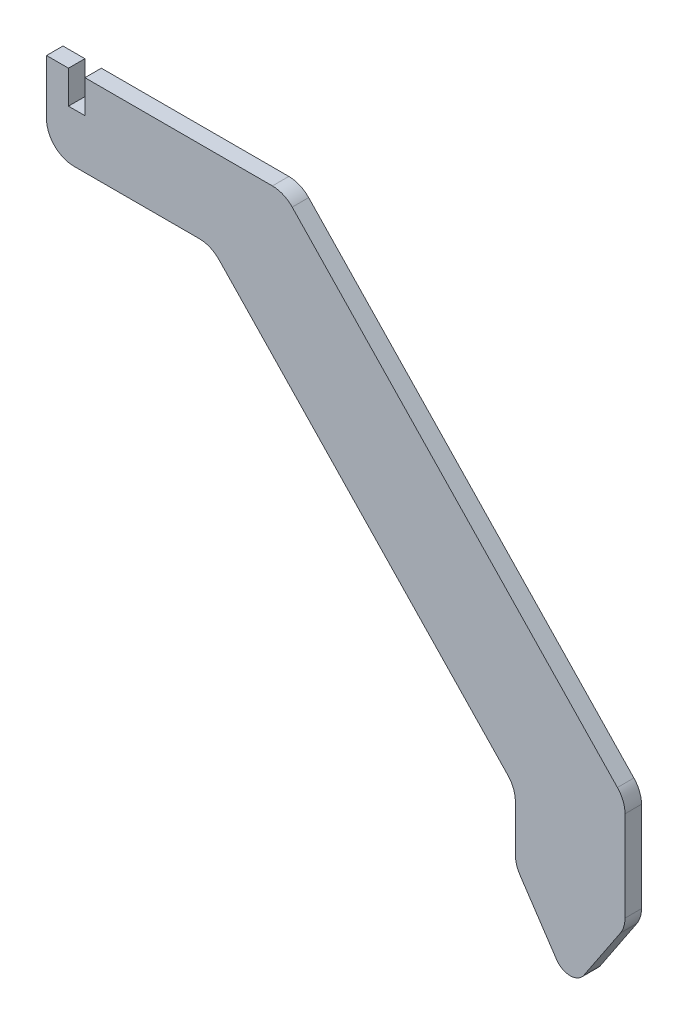
ISO-10303-21;
HEADER;
FILE_DESCRIPTION(('STEP AP214'),'2;1');
FILE_NAME('part.step','',(''),(''),'','','');
FILE_SCHEMA(('AUTOMOTIVE_DESIGN { 1 0 10303 214 1 1 1 1 }'));
ENDSEC;
DATA;
#1=APPLICATION_CONTEXT('core data for automotive mechanical design processes');
#2=APPLICATION_PROTOCOL_DEFINITION('international standard','automotive_design',2000,#1);
#3=PRODUCT_CONTEXT('',#1,'mechanical');
#4=PRODUCT('Part','Part','',(#3));
#5=PRODUCT_RELATED_PRODUCT_CATEGORY('part','',(#4));
#6=PRODUCT_DEFINITION_FORMATION('','',#4);
#7=PRODUCT_DEFINITION_CONTEXT('part definition',#1,'design');
#8=PRODUCT_DEFINITION('design','',#6,#7);
#9=PRODUCT_DEFINITION_SHAPE('','',#8);
#10=(LENGTH_UNIT() NAMED_UNIT(*) SI_UNIT(.MILLI.,.METRE.));
#11=(NAMED_UNIT(*) PLANE_ANGLE_UNIT() SI_UNIT($,.RADIAN.));
#12=(NAMED_UNIT(*) SI_UNIT($,.STERADIAN.) SOLID_ANGLE_UNIT());
#13=UNCERTAINTY_MEASURE_WITH_UNIT(LENGTH_MEASURE(1.E-05),#10,'distance_accuracy_value','');
#14=(GEOMETRIC_REPRESENTATION_CONTEXT(3) GLOBAL_UNCERTAINTY_ASSIGNED_CONTEXT((#13)) GLOBAL_UNIT_ASSIGNED_CONTEXT((#10,
#11,#12)) REPRESENTATION_CONTEXT('',''));
#15=CARTESIAN_POINT('',(0.,0.,0.));
#16=DIRECTION('',(0.,0.,1.));
#17=DIRECTION('',(1.,0.,0.));
#18=AXIS2_PLACEMENT_3D('',#15,#16,#17);
#19=CARTESIAN_POINT('',(0.,-1.5,0.15));
#20=DIRECTION('',(1.,0.,0.));
#21=DIRECTION('',(0.,0.,-1.));
#22=AXIS2_PLACEMENT_3D('',#19,#20,#21);
#23=PLANE('',#22);
#24=DIRECTION('',(0.,-1.,0.));
#25=VECTOR('',#24,1.);
#26=CARTESIAN_POINT('',(0.,-1.5,-0.15));
#27=LINE('',#26,#25);
#28=CARTESIAN_POINT('',(0.,0.,-0.15));
#29=VERTEX_POINT('',#28);
#30=CARTESIAN_POINT('',(0.,-1.,-0.15));
#31=VERTEX_POINT('',#30);
#32=EDGE_CURVE('E222',#29,#31,#27,.T.);
#33=ORIENTED_EDGE('',*,*,#32,.T.);
#34=DIRECTION('',(0.,0.,-1.));
#35=VECTOR('',#34,1.);
#36=CARTESIAN_POINT('',(0.,-1.,0.15));
#37=LINE('',#36,#35);
#38=CARTESIAN_POINT('',(0.,-1.,0.15));
#39=VERTEX_POINT('',#38);
#40=EDGE_CURVE('E291',#31,#39,#37,.F.);
#41=ORIENTED_EDGE('',*,*,#40,.T.);
#42=DIRECTION('',(0.,-1.,0.));
#43=VECTOR('',#42,1.);
#44=CARTESIAN_POINT('',(0.,-1.5,0.15));
#45=LINE('',#44,#43);
#46=CARTESIAN_POINT('',(0.,0.,0.15));
#47=VERTEX_POINT('',#46);
#48=EDGE_CURVE('E255',#47,#39,#45,.T.);
#49=ORIENTED_EDGE('',*,*,#48,.F.);
#50=DIRECTION('',(0.,0.,-1.));
#51=VECTOR('',#50,1.);
#52=CARTESIAN_POINT('',(0.,0.,0.15));
#53=LINE('',#52,#51);
#54=EDGE_CURVE('E221',#47,#29,#53,.T.);
#55=ORIENTED_EDGE('',*,*,#54,.T.);
#56=EDGE_LOOP('',(#33,#41,#49,#55));
#57=FACE_BOUND('',#56,.T.);
#58=ADVANCED_FACE('F37',(#57),#23,.F.);
#59=CARTESIAN_POINT('',(3.,-1.5,0.15));
#60=DIRECTION('',(0.,1.,0.));
#61=DIRECTION('',(-1.,0.,0.));
#62=AXIS2_PLACEMENT_3D('',#59,#60,#61);
#63=PLANE('',#62);
#64=DIRECTION('',(1.,0.,0.));
#65=VECTOR('',#64,1.);
#66=CARTESIAN_POINT('',(3.,-1.5,0.15));
#67=LINE('',#66,#65);
#68=CARTESIAN_POINT('',(0.5,-1.5,0.15));
#69=VERTEX_POINT('',#68);
#70=CARTESIAN_POINT('',(2.78634960002949,-1.5,0.15));
#71=VERTEX_POINT('',#70);
#72=EDGE_CURVE('E348',#69,#71,#67,.T.);
#73=ORIENTED_EDGE('',*,*,#72,.F.);
#74=DIRECTION('',(0.,0.,-1.));
#75=VECTOR('',#74,1.);
#76=CARTESIAN_POINT('',(0.5,-1.5,0.15));
#77=LINE('',#76,#75);
#78=CARTESIAN_POINT('',(0.5,-1.5,-0.15));
#79=VERTEX_POINT('',#78);
#80=EDGE_CURVE('E277',#69,#79,#77,.T.);
#81=ORIENTED_EDGE('',*,*,#80,.T.);
#82=DIRECTION('',(1.,0.,0.));
#83=VECTOR('',#82,1.);
#84=CARTESIAN_POINT('',(3.,-1.5,-0.15));
#85=LINE('',#84,#83);
#86=CARTESIAN_POINT('',(2.78634960002949,-1.5,-0.15));
#87=VERTEX_POINT('',#86);
#88=EDGE_CURVE('E225',#79,#87,#85,.T.);
#89=ORIENTED_EDGE('',*,*,#88,.T.);
#90=DIRECTION('',(0.,0.,-1.));
#91=VECTOR('',#90,1.);
#92=CARTESIAN_POINT('',(2.78634960002949,-1.5,0.15));
#93=LINE('',#92,#91);
#94=EDGE_CURVE('E275',#87,#71,#93,.F.);
#95=ORIENTED_EDGE('',*,*,#94,.T.);
#96=EDGE_LOOP('',(#73,#81,#89,#95));
#97=FACE_BOUND('',#96,.T.);
#98=ADVANCED_FACE('F342',(#97),#63,.F.);
#99=CARTESIAN_POINT('',(8.55,-7.3024926491776,0.15));
#100=DIRECTION('',(0.722654943436056,0.691208964588445,0.));
#101=DIRECTION('',(-0.691208964588445,0.722654943436056,0.));
#102=AXIS2_PLACEMENT_3D('',#99,#100,#101);
#103=PLANE('',#102);
#104=DIRECTION('',(0.691208964588445,-0.722654943436056,0.));
#105=VECTOR('',#104,1.);
#106=CARTESIAN_POINT('',(8.55,-7.3024926491776,-0.15));
#107=LINE('',#106,#105);
#108=CARTESIAN_POINT('',(3.14767707174752,-1.65439551770578,-0.15));
#109=VERTEX_POINT('',#108);
#110=CARTESIAN_POINT('',(8.41132747171803,-7.15751132917778,-0.15));
#111=VERTEX_POINT('',#110);
#112=EDGE_CURVE('E228',#109,#111,#107,.T.);
#113=ORIENTED_EDGE('',*,*,#112,.T.);
#114=DIRECTION('',(0.,0.,-1.));
#115=VECTOR('',#114,1.);
#116=CARTESIAN_POINT('',(8.41132747171803,-7.15751132917778,0.15));
#117=LINE('',#116,#115);
#118=CARTESIAN_POINT('',(8.41132747171803,-7.15751132917778,0.15));
#119=VERTEX_POINT('',#118);
#120=EDGE_CURVE('E329',#111,#119,#117,.F.);
#121=ORIENTED_EDGE('',*,*,#120,.T.);
#122=DIRECTION('',(0.691208964588445,-0.722654943436056,0.));
#123=VECTOR('',#122,1.);
#124=CARTESIAN_POINT('',(8.55,-7.3024926491776,0.15));
#125=LINE('',#124,#123);
#126=CARTESIAN_POINT('',(3.14767707174752,-1.65439551770578,0.15));
#127=VERTEX_POINT('',#126);
#128=EDGE_CURVE('E347',#127,#119,#125,.T.);
#129=ORIENTED_EDGE('',*,*,#128,.F.);
#130=DIRECTION('',(0.,0.,-1.));
#131=VECTOR('',#130,1.);
#132=CARTESIAN_POINT('',(3.14767707174752,-1.65439551770578,-0.15));
#133=LINE('',#132,#131);
#134=EDGE_CURVE('E326',#127,#109,#133,.T.);
#135=ORIENTED_EDGE('',*,*,#134,.T.);
#136=EDGE_LOOP('',(#113,#121,#129,#135));
#137=FACE_BOUND('',#136,.T.);
#138=ADVANCED_FACE('F350',(#137),#103,.F.);
#139=CARTESIAN_POINT('',(8.55,-8.5,0.15));
#140=DIRECTION('',(1.,0.,0.));
#141=DIRECTION('',(0.,1.,0.));
#142=AXIS2_PLACEMENT_3D('',#139,#140,#141);
#143=PLANE('',#142);
#144=DIRECTION('',(0.,-1.,0.));
#145=VECTOR('',#144,1.);
#146=CARTESIAN_POINT('',(8.55,-8.5,-0.15));
#147=LINE('',#146,#145);
#148=CARTESIAN_POINT('',(8.55,-7.503115811472,-0.15));
#149=VERTEX_POINT('',#148);
#150=CARTESIAN_POINT('',(8.55,-8.348612181134,-0.15));
#151=VERTEX_POINT('',#150);
#152=EDGE_CURVE('E231',#149,#151,#147,.T.);
#153=ORIENTED_EDGE('',*,*,#152,.T.);
#154=DIRECTION('',(0.,0.,-1.));
#155=VECTOR('',#154,1.);
#156=CARTESIAN_POINT('',(8.55,-8.348612181134,0.15));
#157=LINE('',#156,#155);
#158=CARTESIAN_POINT('',(8.55,-8.348612181134,0.15));
#159=VERTEX_POINT('',#158);
#160=EDGE_CURVE('E52',#151,#159,#157,.F.);
#161=ORIENTED_EDGE('',*,*,#160,.T.);
#162=DIRECTION('',(0.,-1.,0.));
#163=VECTOR('',#162,1.);
#164=CARTESIAN_POINT('',(8.55,-8.5,0.15));
#165=LINE('',#164,#163);
#166=CARTESIAN_POINT('',(8.55,-7.503115811472,0.15));
#167=VERTEX_POINT('',#166);
#168=EDGE_CURVE('E352',#167,#159,#165,.T.);
#169=ORIENTED_EDGE('',*,*,#168,.F.);
#170=DIRECTION('',(0.,0.,-1.));
#171=VECTOR('',#170,1.);
#172=CARTESIAN_POINT('',(8.55,-7.503115811472,-0.15));
#173=LINE('',#172,#171);
#174=EDGE_CURVE('E322',#167,#149,#173,.T.);
#175=ORIENTED_EDGE('',*,*,#174,.T.);
#176=EDGE_LOOP('',(#153,#161,#169,#175));
#177=FACE_BOUND('',#176,.T.);
#178=ADVANCED_FACE('F415',(#177),#143,.F.);
#179=CARTESIAN_POINT('',(9.55,-10.,0.15));
#180=DIRECTION('',(0.832050294337843,0.55470019622523,0.));
#181=DIRECTION('',(-0.55470019622523,0.832050294337843,0.));
#182=AXIS2_PLACEMENT_3D('',#179,#180,#181);
#183=PLANE('',#182);
#184=DIRECTION('',(0.55470019622523,-0.832050294337843,0.));
#185=VECTOR('',#184,1.);
#186=CARTESIAN_POINT('',(9.55,-10.,0.15));
#187=LINE('',#186,#185);
#188=CARTESIAN_POINT('',(8.63397485283108,-8.62596227924662,0.15));
#189=VERTEX_POINT('',#188);
#190=CARTESIAN_POINT('',(9.30038491169865,-9.62557736754797,0.15));
#191=VERTEX_POINT('',#190);
#192=EDGE_CURVE('E354',#189,#191,#187,.T.);
#193=ORIENTED_EDGE('',*,*,#192,.F.);
#194=DIRECTION('',(0.,0.,-1.));
#195=VECTOR('',#194,1.);
#196=CARTESIAN_POINT('',(8.63397485283108,-8.62596227924662,0.15));
#197=LINE('',#196,#195);
#198=CARTESIAN_POINT('',(8.63397485283108,-8.62596227924662,-0.15));
#199=VERTEX_POINT('',#198);
#200=EDGE_CURVE('E319',#189,#199,#197,.T.);
#201=ORIENTED_EDGE('',*,*,#200,.T.);
#202=DIRECTION('',(0.55470019622523,-0.832050294337843,0.));
#203=VECTOR('',#202,1.);
#204=CARTESIAN_POINT('',(9.55,-10.,-0.15));
#205=LINE('',#204,#203);
#206=CARTESIAN_POINT('',(9.30038491169865,-9.62557736754797,-0.15));
#207=VERTEX_POINT('',#206);
#208=EDGE_CURVE('E233',#199,#207,#205,.T.);
#209=ORIENTED_EDGE('',*,*,#208,.T.);
#210=DIRECTION('',(0.,0.,-1.));
#211=VECTOR('',#210,1.);
#212=CARTESIAN_POINT('',(9.30038491169865,-9.62557736754797,0.15));
#213=LINE('',#212,#211);
#214=EDGE_CURVE('E270',#207,#191,#213,.F.);
#215=ORIENTED_EDGE('',*,*,#214,.T.);
#216=EDGE_LOOP('',(#193,#201,#209,#215));
#217=FACE_BOUND('',#216,.T.);
#218=ADVANCED_FACE('F418',(#217),#183,.F.);
#219=CARTESIAN_POINT('',(10.55,-8.5,0.15));
#220=DIRECTION('',(-0.832050294337844,0.554700196225228,0.));
#221=DIRECTION('',(-0.554700196225228,-0.832050294337844,0.));
#222=AXIS2_PLACEMENT_3D('',#219,#220,#221);
#223=PLANE('',#222);
#224=DIRECTION('',(0.554700196225228,0.832050294337844,0.));
#225=VECTOR('',#224,1.);
#226=CARTESIAN_POINT('',(10.55,-8.5,-0.15));
#227=LINE('',#226,#225);
#228=CARTESIAN_POINT('',(9.79961508830135,-9.62557736754797,-0.15));
#229=VERTEX_POINT('',#228);
#230=CARTESIAN_POINT('',(10.4660251471689,-8.62596227924662,-0.15));
#231=VERTEX_POINT('',#230);
#232=EDGE_CURVE('E235',#229,#231,#227,.T.);
#233=ORIENTED_EDGE('',*,*,#232,.T.);
#234=DIRECTION('',(0.,0.,-1.));
#235=VECTOR('',#234,1.);
#236=CARTESIAN_POINT('',(10.4660251471689,-8.62596227924662,0.15));
#237=LINE('',#236,#235);
#238=CARTESIAN_POINT('',(10.4660251471689,-8.62596227924662,0.15));
#239=VERTEX_POINT('',#238);
#240=EDGE_CURVE('E317',#231,#239,#237,.F.);
#241=ORIENTED_EDGE('',*,*,#240,.T.);
#242=DIRECTION('',(0.554700196225228,0.832050294337844,0.));
#243=VECTOR('',#242,1.);
#244=CARTESIAN_POINT('',(10.55,-8.5,0.15));
#245=LINE('',#244,#243);
#246=CARTESIAN_POINT('',(9.79961508830135,-9.62557736754797,0.15));
#247=VERTEX_POINT('',#246);
#248=EDGE_CURVE('E360',#247,#239,#245,.T.);
#249=ORIENTED_EDGE('',*,*,#248,.F.);
#250=DIRECTION('',(0.,0.,-1.));
#251=VECTOR('',#250,1.);
#252=CARTESIAN_POINT('',(9.79961508830135,-9.62557736754797,0.15));
#253=LINE('',#252,#251);
#254=EDGE_CURVE('E206',#247,#229,#253,.T.);
#255=ORIENTED_EDGE('',*,*,#254,.T.);
#256=EDGE_LOOP('',(#233,#241,#249,#255));
#257=FACE_BOUND('',#256,.T.);
#258=ADVANCED_FACE('F421',(#257),#223,.F.);
#259=CARTESIAN_POINT('',(10.55,-6.5,0.15));
#260=DIRECTION('',(-1.,0.,0.));
#261=DIRECTION('',(0.,0.,1.));
#262=AXIS2_PLACEMENT_3D('',#259,#260,#261);
#263=PLANE('',#262);
#264=DIRECTION('',(0.,1.,0.));
#265=VECTOR('',#264,1.);
#266=CARTESIAN_POINT('',(10.55,-6.5,-0.15));
#267=LINE('',#266,#265);
#268=CARTESIAN_POINT('',(10.55,-8.348612181134,-0.15));
#269=VERTEX_POINT('',#268);
#270=CARTESIAN_POINT('',(10.55,-6.7006231622944,-0.15));
#271=VERTEX_POINT('',#270);
#272=EDGE_CURVE('E238',#269,#271,#267,.T.);
#273=ORIENTED_EDGE('',*,*,#272,.T.);
#274=DIRECTION('',(0.,0.,-1.));
#275=VECTOR('',#274,1.);
#276=CARTESIAN_POINT('',(10.55,-6.7006231622944,0.15));
#277=LINE('',#276,#275);
#278=CARTESIAN_POINT('',(10.55,-6.7006231622944,0.15));
#279=VERTEX_POINT('',#278);
#280=EDGE_CURVE('E315',#271,#279,#277,.F.);
#281=ORIENTED_EDGE('',*,*,#280,.T.);
#282=DIRECTION('',(0.,1.,0.));
#283=VECTOR('',#282,1.);
#284=CARTESIAN_POINT('',(10.55,-6.5,0.15));
#285=LINE('',#284,#283);
#286=CARTESIAN_POINT('',(10.55,-8.348612181134,0.15));
#287=VERTEX_POINT('',#286);
#288=EDGE_CURVE('E363',#287,#279,#285,.T.);
#289=ORIENTED_EDGE('',*,*,#288,.F.);
#290=DIRECTION('',(0.,0.,-1.));
#291=VECTOR('',#290,1.);
#292=CARTESIAN_POINT('',(10.55,-8.348612181134,0.15));
#293=LINE('',#292,#291);
#294=EDGE_CURVE('E312',#287,#269,#293,.T.);
#295=ORIENTED_EDGE('',*,*,#294,.T.);
#296=EDGE_LOOP('',(#273,#281,#289,#295));
#297=FACE_BOUND('',#296,.T.);
#298=ADVANCED_FACE('F425',(#297),#263,.F.);
#299=CARTESIAN_POINT('',(4.3328443427476,0.,0.15));
#300=DIRECTION('',(-0.722654943436056,-0.691208964588445,0.));
#301=DIRECTION('',(0.691208964588445,-0.722654943436056,0.));
#302=AXIS2_PLACEMENT_3D('',#299,#300,#301);
#303=PLANE('',#302);
#304=DIRECTION('',(-0.691208964588445,0.722654943436056,0.));
#305=VECTOR('',#304,1.);
#306=CARTESIAN_POINT('',(4.3328443427476,0.,-0.15));
#307=LINE('',#306,#305);
#308=CARTESIAN_POINT('',(10.411327471718,-6.35501868000018,-0.15));
#309=VERTEX_POINT('',#308);
#310=CARTESIAN_POINT('',(4.48052141449512,-0.154395517705778,-0.15));
#311=VERTEX_POINT('',#310);
#312=EDGE_CURVE('E241',#309,#311,#307,.T.);
#313=ORIENTED_EDGE('',*,*,#312,.T.);
#314=DIRECTION('',(0.,0.,-1.));
#315=VECTOR('',#314,1.);
#316=CARTESIAN_POINT('',(4.48052141449512,-0.154395517705778,0.15));
#317=LINE('',#316,#315);
#318=CARTESIAN_POINT('',(4.48052141449512,-0.154395517705778,0.15));
#319=VERTEX_POINT('',#318);
#320=EDGE_CURVE('E309',#311,#319,#317,.F.);
#321=ORIENTED_EDGE('',*,*,#320,.T.);
#322=DIRECTION('',(-0.691208964588445,0.722654943436056,0.));
#323=VECTOR('',#322,1.);
#324=CARTESIAN_POINT('',(4.3328443427476,0.,0.15));
#325=LINE('',#324,#323);
#326=CARTESIAN_POINT('',(10.411327471718,-6.35501868000018,0.15));
#327=VERTEX_POINT('',#326);
#328=EDGE_CURVE('E197',#327,#319,#325,.T.);
#329=ORIENTED_EDGE('',*,*,#328,.F.);
#330=DIRECTION('',(0.,0.,-1.));
#331=VECTOR('',#330,1.);
#332=CARTESIAN_POINT('',(10.411327471718,-6.35501868000018,0.15));
#333=LINE('',#332,#331);
#334=EDGE_CURVE('E306',#327,#309,#333,.T.);
#335=ORIENTED_EDGE('',*,*,#334,.T.);
#336=EDGE_LOOP('',(#313,#321,#329,#335));
#337=FACE_BOUND('',#336,.T.);
#338=ADVANCED_FACE('F429',(#337),#303,.F.);
#339=CARTESIAN_POINT('',(0.7,0.,0.15));
#340=DIRECTION('',(0.,-1.,0.));
#341=DIRECTION('',(1.,0.,0.));
#342=AXIS2_PLACEMENT_3D('',#339,#340,#341);
#343=PLANE('',#342);
#344=DIRECTION('',(-1.,0.,0.));
#345=VECTOR('',#344,1.);
#346=CARTESIAN_POINT('',(0.7,0.,0.15));
#347=LINE('',#346,#345);
#348=CARTESIAN_POINT('',(4.11919394277709,0.,0.15));
#349=VERTEX_POINT('',#348);
#350=CARTESIAN_POINT('',(0.7,0.,0.15));
#351=VERTEX_POINT('',#350);
#352=EDGE_CURVE('E183',#349,#351,#347,.T.);
#353=ORIENTED_EDGE('',*,*,#352,.F.);
#354=DIRECTION('',(0.,0.,-1.));
#355=VECTOR('',#354,1.);
#356=CARTESIAN_POINT('',(4.11919394277709,0.,0.15));
#357=LINE('',#356,#355);
#358=CARTESIAN_POINT('',(4.11919394277709,0.,-0.15));
#359=VERTEX_POINT('',#358);
#360=EDGE_CURVE('E303',#349,#359,#357,.T.);
#361=ORIENTED_EDGE('',*,*,#360,.T.);
#362=DIRECTION('',(-1.,0.,0.));
#363=VECTOR('',#362,1.);
#364=CARTESIAN_POINT('',(0.7,0.,-0.15));
#365=LINE('',#364,#363);
#366=CARTESIAN_POINT('',(0.7,0.,-0.15));
#367=VERTEX_POINT('',#366);
#368=EDGE_CURVE('E203',#359,#367,#365,.T.);
#369=ORIENTED_EDGE('',*,*,#368,.T.);
#370=DIRECTION('',(0.,0.,-1.));
#371=VECTOR('',#370,1.);
#372=CARTESIAN_POINT('',(0.7,0.,0.15));
#373=LINE('',#372,#371);
#374=EDGE_CURVE('E200',#351,#367,#373,.T.);
#375=ORIENTED_EDGE('',*,*,#374,.F.);
#376=EDGE_LOOP('',(#353,#361,#369,#375));
#377=FACE_BOUND('',#376,.T.);
#378=ADVANCED_FACE('F201',(#377),#343,.F.);
#379=CARTESIAN_POINT('',(0.7,-0.6,0.15));
#380=DIRECTION('',(1.,0.,0.));
#381=DIRECTION('',(0.,1.,0.));
#382=AXIS2_PLACEMENT_3D('',#379,#380,#381);
#383=PLANE('',#382);
#384=DIRECTION('',(0.,-1.,0.));
#385=VECTOR('',#384,1.);
#386=CARTESIAN_POINT('',(0.7,-0.6,-0.15));
#387=LINE('',#386,#385);
#388=CARTESIAN_POINT('',(0.7,-0.6,-0.15));
#389=VERTEX_POINT('',#388);
#390=EDGE_CURVE('E247',#367,#389,#387,.T.);
#391=ORIENTED_EDGE('',*,*,#390,.T.);
#392=DIRECTION('',(0.,0.,-1.));
#393=VECTOR('',#392,1.);
#394=CARTESIAN_POINT('',(0.7,-0.6,0.15));
#395=LINE('',#394,#393);
#396=CARTESIAN_POINT('',(0.7,-0.6,0.15));
#397=VERTEX_POINT('',#396);
#398=EDGE_CURVE('E207',#397,#389,#395,.T.);
#399=ORIENTED_EDGE('',*,*,#398,.F.);
#400=DIRECTION('',(0.,-1.,0.));
#401=VECTOR('',#400,1.);
#402=CARTESIAN_POINT('',(0.7,-0.6,0.15));
#403=LINE('',#402,#401);
#404=EDGE_CURVE('E188',#351,#397,#403,.T.);
#405=ORIENTED_EDGE('',*,*,#404,.F.);
#406=ORIENTED_EDGE('',*,*,#374,.T.);
#407=EDGE_LOOP('',(#391,#399,#405,#406));
#408=FACE_BOUND('',#407,.T.);
#409=ADVANCED_FACE('F209',(#408),#383,.F.);
#410=CARTESIAN_POINT('',(0.4,-0.6,0.15));
#411=DIRECTION('',(0.,-1.,0.));
#412=DIRECTION('',(0.,0.,-1.));
#413=AXIS2_PLACEMENT_3D('',#410,#411,#412);
#414=PLANE('',#413);
#415=DIRECTION('',(-1.,0.,0.));
#416=VECTOR('',#415,1.);
#417=CARTESIAN_POINT('',(0.4,-0.6,-0.15));
#418=LINE('',#417,#416);
#419=CARTESIAN_POINT('',(0.4,-0.6,-0.15));
#420=VERTEX_POINT('',#419);
#421=EDGE_CURVE('E249',#389,#420,#418,.T.);
#422=ORIENTED_EDGE('',*,*,#421,.T.);
#423=DIRECTION('',(0.,0.,-1.));
#424=VECTOR('',#423,1.);
#425=CARTESIAN_POINT('',(0.4,-0.6,0.15));
#426=LINE('',#425,#424);
#427=CARTESIAN_POINT('',(0.4,-0.6,0.15));
#428=VERTEX_POINT('',#427);
#429=EDGE_CURVE('E261',#428,#420,#426,.T.);
#430=ORIENTED_EDGE('',*,*,#429,.F.);
#431=DIRECTION('',(-1.,0.,0.));
#432=VECTOR('',#431,1.);
#433=CARTESIAN_POINT('',(0.4,-0.6,0.15));
#434=LINE('',#433,#432);
#435=EDGE_CURVE('E212',#397,#428,#434,.T.);
#436=ORIENTED_EDGE('',*,*,#435,.F.);
#437=ORIENTED_EDGE('',*,*,#398,.T.);
#438=EDGE_LOOP('',(#422,#430,#436,#437));
#439=FACE_BOUND('',#438,.T.);
#440=ADVANCED_FACE('F377',(#439),#414,.F.);
#441=CARTESIAN_POINT('',(0.4,0.,0.15));
#442=DIRECTION('',(-1.,0.,0.));
#443=DIRECTION('',(0.,-1.,0.));
#444=AXIS2_PLACEMENT_3D('',#441,#442,#443);
#445=PLANE('',#444);
#446=DIRECTION('',(0.,1.,0.));
#447=VECTOR('',#446,1.);
#448=CARTESIAN_POINT('',(0.4,0.,-0.15));
#449=LINE('',#448,#447);
#450=CARTESIAN_POINT('',(0.4,0.,-0.15));
#451=VERTEX_POINT('',#450);
#452=EDGE_CURVE('E251',#420,#451,#449,.T.);
#453=ORIENTED_EDGE('',*,*,#452,.T.);
#454=DIRECTION('',(0.,0.,-1.));
#455=VECTOR('',#454,1.);
#456=CARTESIAN_POINT('',(0.4,0.,0.15));
#457=LINE('',#456,#455);
#458=CARTESIAN_POINT('',(0.4,0.,0.15));
#459=VERTEX_POINT('',#458);
#460=EDGE_CURVE('E258',#459,#451,#457,.T.);
#461=ORIENTED_EDGE('',*,*,#460,.F.);
#462=DIRECTION('',(0.,1.,0.));
#463=VECTOR('',#462,1.);
#464=CARTESIAN_POINT('',(0.4,0.,0.15));
#465=LINE('',#464,#463);
#466=EDGE_CURVE('E214',#428,#459,#465,.T.);
#467=ORIENTED_EDGE('',*,*,#466,.F.);
#468=ORIENTED_EDGE('',*,*,#429,.T.);
#469=EDGE_LOOP('',(#453,#461,#467,#468));
#470=FACE_BOUND('',#469,.T.);
#471=ADVANCED_FACE('F384',(#470),#445,.F.);
#472=CARTESIAN_POINT('',(0.,0.,0.15));
#473=DIRECTION('',(0.,-1.,0.));
#474=DIRECTION('',(0.,0.,-1.));
#475=AXIS2_PLACEMENT_3D('',#472,#473,#474);
#476=PLANE('',#475);
#477=DIRECTION('',(-1.,0.,0.));
#478=VECTOR('',#477,1.);
#479=CARTESIAN_POINT('',(0.,0.,-0.15));
#480=LINE('',#479,#478);
#481=EDGE_CURVE('E253',#451,#29,#480,.T.);
#482=ORIENTED_EDGE('',*,*,#481,.T.);
#483=ORIENTED_EDGE('',*,*,#54,.F.);
#484=DIRECTION('',(-1.,0.,0.));
#485=VECTOR('',#484,1.);
#486=CARTESIAN_POINT('',(0.,0.,0.15));
#487=LINE('',#486,#485);
#488=EDGE_CURVE('E219',#459,#47,#487,.T.);
#489=ORIENTED_EDGE('',*,*,#488,.F.);
#490=ORIENTED_EDGE('',*,*,#460,.T.);
#491=EDGE_LOOP('',(#482,#483,#489,#490));
#492=FACE_BOUND('',#491,.T.);
#493=ADVANCED_FACE('F387',(#492),#476,.F.);
#494=CARTESIAN_POINT('',(0.,0.,0.15));
#495=DIRECTION('',(0.,0.,-1.));
#496=DIRECTION('',(-1.,0.,0.));
#497=AXIS2_PLACEMENT_3D('',#494,#495,#496);
#498=PLANE('',#497);
#499=ORIENTED_EDGE('',*,*,#48,.T.);
#500=CARTESIAN_POINT('',(0.5,-1.,0.15));
#501=DIRECTION('',(0.,0.,-1.));
#502=DIRECTION('',(-1.,0.,0.));
#503=AXIS2_PLACEMENT_3D('',#500,#501,#502);
#504=CIRCLE('',#503,0.5);
#505=EDGE_CURVE('E301',#39,#69,#504,.F.);
#506=ORIENTED_EDGE('',*,*,#505,.T.);
#507=ORIENTED_EDGE('',*,*,#72,.T.);
#508=CARTESIAN_POINT('',(2.78634960002949,-2.,0.15));
#509=DIRECTION('',(0.,0.,-1.));
#510=DIRECTION('',(-1.,0.,0.));
#511=AXIS2_PLACEMENT_3D('',#508,#509,#510);
#512=CIRCLE('',#511,0.5);
#513=EDGE_CURVE('E11',#71,#127,#512,.T.);
#514=ORIENTED_EDGE('',*,*,#513,.T.);
#515=ORIENTED_EDGE('',*,*,#128,.T.);
#516=CARTESIAN_POINT('',(8.05,-7.503115811472,0.15));
#517=DIRECTION('',(0.,0.,-1.));
#518=DIRECTION('',(-1.,0.,0.));
#519=AXIS2_PLACEMENT_3D('',#516,#517,#518);
#520=CIRCLE('',#519,0.5);
#521=EDGE_CURVE('E59',#119,#167,#520,.T.);
#522=ORIENTED_EDGE('',*,*,#521,.T.);
#523=ORIENTED_EDGE('',*,*,#168,.T.);
#524=CARTESIAN_POINT('',(9.05,-8.348612181134,0.15));
#525=DIRECTION('',(0.,0.,-1.));
#526=DIRECTION('',(-1.,0.,0.));
#527=AXIS2_PLACEMENT_3D('',#524,#525,#526);
#528=CIRCLE('',#527,0.5);
#529=EDGE_CURVE('E293',#159,#189,#528,.F.);
#530=ORIENTED_EDGE('',*,*,#529,.T.);
#531=ORIENTED_EDGE('',*,*,#192,.T.);
#532=CARTESIAN_POINT('',(9.55,-9.4591673086804,0.15));
#533=DIRECTION('',(0.,0.,-1.));
#534=DIRECTION('',(-1.,0.,0.));
#535=AXIS2_PLACEMENT_3D('',#532,#533,#534);
#536=CIRCLE('',#535,0.3);
#537=EDGE_CURVE('E273',#191,#247,#536,.F.);
#538=ORIENTED_EDGE('',*,*,#537,.T.);
#539=ORIENTED_EDGE('',*,*,#248,.T.);
#540=CARTESIAN_POINT('',(10.05,-8.348612181134,0.15));
#541=DIRECTION('',(0.,0.,-1.));
#542=DIRECTION('',(-1.,0.,0.));
#543=AXIS2_PLACEMENT_3D('',#540,#541,#542);
#544=CIRCLE('',#543,0.5);
#545=EDGE_CURVE('E295',#239,#287,#544,.F.);
#546=ORIENTED_EDGE('',*,*,#545,.T.);
#547=ORIENTED_EDGE('',*,*,#288,.T.);
#548=CARTESIAN_POINT('',(10.05,-6.7006231622944,0.15));
#549=DIRECTION('',(0.,0.,-1.));
#550=DIRECTION('',(-1.,0.,0.));
#551=AXIS2_PLACEMENT_3D('',#548,#549,#550);
#552=CIRCLE('',#551,0.5);
#553=EDGE_CURVE('E297',#279,#327,#552,.F.);
#554=ORIENTED_EDGE('',*,*,#553,.T.);
#555=ORIENTED_EDGE('',*,*,#328,.T.);
#556=CARTESIAN_POINT('',(4.11919394277709,-0.5,0.15));
#557=DIRECTION('',(0.,0.,-1.));
#558=DIRECTION('',(-1.,0.,0.));
#559=AXIS2_PLACEMENT_3D('',#556,#557,#558);
#560=CIRCLE('',#559,0.5);
#561=EDGE_CURVE('E192',#319,#349,#560,.F.);
#562=ORIENTED_EDGE('',*,*,#561,.T.);
#563=ORIENTED_EDGE('',*,*,#352,.T.);
#564=ORIENTED_EDGE('',*,*,#404,.T.);
#565=ORIENTED_EDGE('',*,*,#435,.T.);
#566=ORIENTED_EDGE('',*,*,#466,.T.);
#567=ORIENTED_EDGE('',*,*,#488,.T.);
#568=EDGE_LOOP('',(#499,#506,#507,#514,#515,#522,#523,#530,#531,#538,#539,#546,#547,#554,#555,
#562,#563,#564,#565,#566,#567));
#569=FACE_BOUND('',#568,.T.);
#570=ADVANCED_FACE('F186',(#569),#498,.F.);
#571=CARTESIAN_POINT('',(0.,0.,-0.15));
#572=DIRECTION('',(0.,0.,-1.));
#573=DIRECTION('',(-1.,0.,0.));
#574=AXIS2_PLACEMENT_3D('',#571,#572,#573);
#575=PLANE('',#574);
#576=ORIENTED_EDGE('',*,*,#88,.F.);
#577=CARTESIAN_POINT('',(0.5,-1.,-0.15));
#578=DIRECTION('',(0.,0.,-1.));
#579=DIRECTION('',(-1.,0.,0.));
#580=AXIS2_PLACEMENT_3D('',#577,#578,#579);
#581=CIRCLE('',#580,0.5);
#582=EDGE_CURVE('E289',#79,#31,#581,.T.);
#583=ORIENTED_EDGE('',*,*,#582,.T.);
#584=ORIENTED_EDGE('',*,*,#32,.F.);
#585=ORIENTED_EDGE('',*,*,#481,.F.);
#586=ORIENTED_EDGE('',*,*,#452,.F.);
#587=ORIENTED_EDGE('',*,*,#421,.F.);
#588=ORIENTED_EDGE('',*,*,#390,.F.);
#589=ORIENTED_EDGE('',*,*,#368,.F.);
#590=CARTESIAN_POINT('',(4.11919394277709,-0.5,-0.15));
#591=DIRECTION('',(0.,0.,-1.));
#592=DIRECTION('',(-1.,0.,0.));
#593=AXIS2_PLACEMENT_3D('',#590,#591,#592);
#594=CIRCLE('',#593,0.5);
#595=EDGE_CURVE('E286',#359,#311,#594,.T.);
#596=ORIENTED_EDGE('',*,*,#595,.T.);
#597=ORIENTED_EDGE('',*,*,#312,.F.);
#598=CARTESIAN_POINT('',(10.05,-6.7006231622944,-0.15));
#599=DIRECTION('',(0.,0.,-1.));
#600=DIRECTION('',(-1.,0.,0.));
#601=AXIS2_PLACEMENT_3D('',#598,#599,#600);
#602=CIRCLE('',#601,0.5);
#603=EDGE_CURVE('E284',#309,#271,#602,.T.);
#604=ORIENTED_EDGE('',*,*,#603,.T.);
#605=ORIENTED_EDGE('',*,*,#272,.F.);
#606=CARTESIAN_POINT('',(10.05,-8.348612181134,-0.15));
#607=DIRECTION('',(0.,0.,-1.));
#608=DIRECTION('',(-1.,0.,0.));
#609=AXIS2_PLACEMENT_3D('',#606,#607,#608);
#610=CIRCLE('',#609,0.5);
#611=EDGE_CURVE('E282',#269,#231,#610,.T.);
#612=ORIENTED_EDGE('',*,*,#611,.T.);
#613=ORIENTED_EDGE('',*,*,#232,.F.);
#614=CARTESIAN_POINT('',(9.55,-9.4591673086804,-0.15));
#615=DIRECTION('',(0.,0.,-1.));
#616=DIRECTION('',(-1.,0.,0.));
#617=AXIS2_PLACEMENT_3D('',#614,#615,#616);
#618=CIRCLE('',#617,0.3);
#619=EDGE_CURVE('E267',#229,#207,#618,.T.);
#620=ORIENTED_EDGE('',*,*,#619,.T.);
#621=ORIENTED_EDGE('',*,*,#208,.F.);
#622=CARTESIAN_POINT('',(9.05,-8.348612181134,-0.15));
#623=DIRECTION('',(0.,0.,-1.));
#624=DIRECTION('',(-1.,0.,0.));
#625=AXIS2_PLACEMENT_3D('',#622,#623,#624);
#626=CIRCLE('',#625,0.5);
#627=EDGE_CURVE('E280',#199,#151,#626,.T.);
#628=ORIENTED_EDGE('',*,*,#627,.T.);
#629=ORIENTED_EDGE('',*,*,#152,.F.);
#630=CARTESIAN_POINT('',(8.05,-7.503115811472,-0.15));
#631=DIRECTION('',(0.,0.,-1.));
#632=DIRECTION('',(-1.,0.,0.));
#633=AXIS2_PLACEMENT_3D('',#630,#631,#632);
#634=CIRCLE('',#633,0.5);
#635=EDGE_CURVE('E331',#149,#111,#634,.F.);
#636=ORIENTED_EDGE('',*,*,#635,.T.);
#637=ORIENTED_EDGE('',*,*,#112,.F.);
#638=CARTESIAN_POINT('',(2.78634960002949,-2.,-0.15));
#639=DIRECTION('',(0.,0.,-1.));
#640=DIRECTION('',(-1.,0.,0.));
#641=AXIS2_PLACEMENT_3D('',#638,#639,#640);
#642=CIRCLE('',#641,0.5);
#643=EDGE_CURVE('E45',#109,#87,#642,.F.);
#644=ORIENTED_EDGE('',*,*,#643,.T.);
#645=EDGE_LOOP('',(#576,#583,#584,#585,#586,#587,#588,#589,#596,#597,#604,#605,#612,#613,#620,
#621,#628,#629,#636,#637,#644));
#646=FACE_BOUND('',#645,.T.);
#647=ADVANCED_FACE('F336',(#646),#575,.T.);
#648=CARTESIAN_POINT('',(9.55,-9.4591673086804,0.15));
#649=DIRECTION('',(0.,0.,-1.));
#650=DIRECTION('',(-1.,0.,0.));
#651=AXIS2_PLACEMENT_3D('',#648,#649,#650);
#652=CYLINDRICAL_SURFACE('',#651,0.3);
#653=ORIENTED_EDGE('',*,*,#537,.F.);
#654=ORIENTED_EDGE('',*,*,#214,.F.);
#655=ORIENTED_EDGE('',*,*,#619,.F.);
#656=ORIENTED_EDGE('',*,*,#254,.F.);
#657=EDGE_LOOP('',(#653,#654,#655,#656));
#658=FACE_BOUND('',#657,.T.);
#659=ADVANCED_FACE('F396',(#658),#652,.T.);
#660=CARTESIAN_POINT('',(0.5,-1.,0.15));
#661=DIRECTION('',(0.,0.,-1.));
#662=DIRECTION('',(-1.,0.,0.));
#663=AXIS2_PLACEMENT_3D('',#660,#661,#662);
#664=CYLINDRICAL_SURFACE('',#663,0.5);
#665=ORIENTED_EDGE('',*,*,#505,.F.);
#666=ORIENTED_EDGE('',*,*,#40,.F.);
#667=ORIENTED_EDGE('',*,*,#582,.F.);
#668=ORIENTED_EDGE('',*,*,#80,.F.);
#669=EDGE_LOOP('',(#665,#666,#667,#668));
#670=FACE_BOUND('',#669,.T.);
#671=ADVANCED_FACE('F394',(#670),#664,.T.);
#672=CARTESIAN_POINT('',(4.11919394277709,-0.5,0.15));
#673=DIRECTION('',(0.,0.,-1.));
#674=DIRECTION('',(-1.,0.,0.));
#675=AXIS2_PLACEMENT_3D('',#672,#673,#674);
#676=CYLINDRICAL_SURFACE('',#675,0.5);
#677=ORIENTED_EDGE('',*,*,#561,.F.);
#678=ORIENTED_EDGE('',*,*,#320,.F.);
#679=ORIENTED_EDGE('',*,*,#595,.F.);
#680=ORIENTED_EDGE('',*,*,#360,.F.);
#681=EDGE_LOOP('',(#677,#678,#679,#680));
#682=FACE_BOUND('',#681,.T.);
#683=ADVANCED_FACE('F372',(#682),#676,.T.);
#684=CARTESIAN_POINT('',(10.05,-6.7006231622944,0.15));
#685=DIRECTION('',(0.,0.,-1.));
#686=DIRECTION('',(-1.,0.,0.));
#687=AXIS2_PLACEMENT_3D('',#684,#685,#686);
#688=CYLINDRICAL_SURFACE('',#687,0.5);
#689=ORIENTED_EDGE('',*,*,#553,.F.);
#690=ORIENTED_EDGE('',*,*,#280,.F.);
#691=ORIENTED_EDGE('',*,*,#603,.F.);
#692=ORIENTED_EDGE('',*,*,#334,.F.);
#693=EDGE_LOOP('',(#689,#690,#691,#692));
#694=FACE_BOUND('',#693,.T.);
#695=ADVANCED_FACE('F402',(#694),#688,.T.);
#696=CARTESIAN_POINT('',(10.05,-8.348612181134,0.15));
#697=DIRECTION('',(0.,0.,-1.));
#698=DIRECTION('',(-1.,0.,0.));
#699=AXIS2_PLACEMENT_3D('',#696,#697,#698);
#700=CYLINDRICAL_SURFACE('',#699,0.5);
#701=ORIENTED_EDGE('',*,*,#545,.F.);
#702=ORIENTED_EDGE('',*,*,#240,.F.);
#703=ORIENTED_EDGE('',*,*,#611,.F.);
#704=ORIENTED_EDGE('',*,*,#294,.F.);
#705=EDGE_LOOP('',(#701,#702,#703,#704));
#706=FACE_BOUND('',#705,.T.);
#707=ADVANCED_FACE('F555',(#706),#700,.T.);
#708=CARTESIAN_POINT('',(9.05,-8.348612181134,0.15));
#709=DIRECTION('',(0.,0.,-1.));
#710=DIRECTION('',(-1.,0.,0.));
#711=AXIS2_PLACEMENT_3D('',#708,#709,#710);
#712=CYLINDRICAL_SURFACE('',#711,0.5);
#713=ORIENTED_EDGE('',*,*,#529,.F.);
#714=ORIENTED_EDGE('',*,*,#160,.F.);
#715=ORIENTED_EDGE('',*,*,#627,.F.);
#716=ORIENTED_EDGE('',*,*,#200,.F.);
#717=EDGE_LOOP('',(#713,#714,#715,#716));
#718=FACE_BOUND('',#717,.T.);
#719=ADVANCED_FACE('F564',(#718),#712,.T.);
#720=CARTESIAN_POINT('',(8.05,-7.503115811472,0.15));
#721=DIRECTION('',(0.,0.,1.));
#722=DIRECTION('',(1.,0.,0.));
#723=AXIS2_PLACEMENT_3D('',#720,#721,#722);
#724=CYLINDRICAL_SURFACE('',#723,0.5);
#725=ORIENTED_EDGE('',*,*,#521,.F.);
#726=ORIENTED_EDGE('',*,*,#120,.F.);
#727=ORIENTED_EDGE('',*,*,#635,.F.);
#728=ORIENTED_EDGE('',*,*,#174,.F.);
#729=EDGE_LOOP('',(#725,#726,#727,#728));
#730=FACE_BOUND('',#729,.T.);
#731=ADVANCED_FACE('F573',(#730),#724,.F.);
#732=CARTESIAN_POINT('',(2.78634960002949,-2.,0.15));
#733=DIRECTION('',(0.,0.,1.));
#734=DIRECTION('',(1.,0.,0.));
#735=AXIS2_PLACEMENT_3D('',#732,#733,#734);
#736=CYLINDRICAL_SURFACE('',#735,0.5);
#737=ORIENTED_EDGE('',*,*,#513,.F.);
#738=ORIENTED_EDGE('',*,*,#94,.F.);
#739=ORIENTED_EDGE('',*,*,#643,.F.);
#740=ORIENTED_EDGE('',*,*,#134,.F.);
#741=EDGE_LOOP('',(#737,#738,#739,#740));
#742=FACE_BOUND('',#741,.T.);
#743=ADVANCED_FACE('F39',(#742),#736,.F.);
#744=CLOSED_SHELL('',(#58,#98,#138,#178,#218,#258,#298,#338,#378,#409,#440,#471,#493,#570,#647,
#659,#671,#683,#695,#707,#719,#731,#743));
#745=MANIFOLD_SOLID_BREP('B2',#744);
#746=ADVANCED_BREP_SHAPE_REPRESENTATION('',(#18,#745),#14);
#747=SHAPE_DEFINITION_REPRESENTATION(#9,#746);
ENDSEC;
END-ISO-10303-21;
